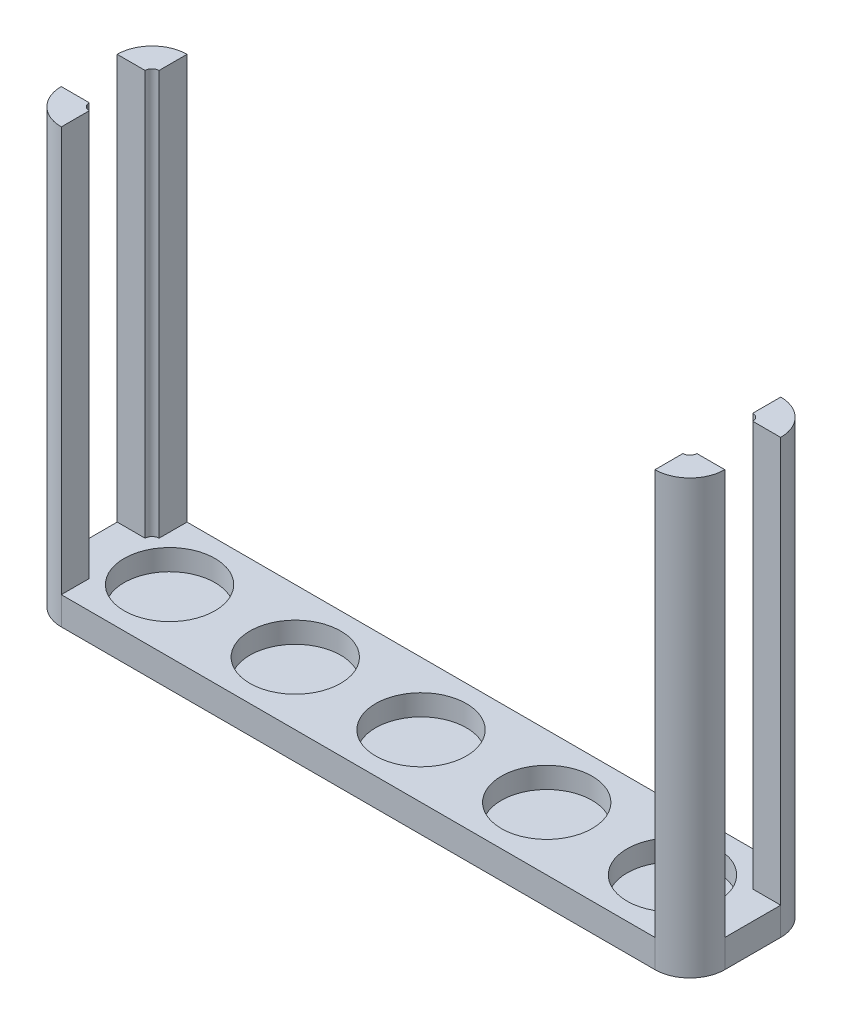
ISO-10303-21;
HEADER;
FILE_DESCRIPTION(('STEP AP214'),'2;1');
FILE_NAME('part.step','',(''),(''),'','','');
FILE_SCHEMA(('AUTOMOTIVE_DESIGN { 1 0 10303 214 1 1 1 1 }'));
ENDSEC;
DATA;
#1=APPLICATION_CONTEXT('core data for automotive mechanical design processes');
#2=APPLICATION_PROTOCOL_DEFINITION('international standard','automotive_design',2000,#1);
#3=PRODUCT_CONTEXT('',#1,'mechanical');
#4=PRODUCT('Part','Part','',(#3));
#5=PRODUCT_RELATED_PRODUCT_CATEGORY('part','',(#4));
#6=PRODUCT_DEFINITION_FORMATION('','',#4);
#7=PRODUCT_DEFINITION_CONTEXT('part definition',#1,'design');
#8=PRODUCT_DEFINITION('design','',#6,#7);
#9=PRODUCT_DEFINITION_SHAPE('','',#8);
#10=(LENGTH_UNIT() NAMED_UNIT(*) SI_UNIT(.MILLI.,.METRE.));
#11=(NAMED_UNIT(*) PLANE_ANGLE_UNIT() SI_UNIT($,.RADIAN.));
#12=(NAMED_UNIT(*) SI_UNIT($,.STERADIAN.) SOLID_ANGLE_UNIT());
#13=UNCERTAINTY_MEASURE_WITH_UNIT(LENGTH_MEASURE(1.E-05),#10,'distance_accuracy_value','');
#14=(GEOMETRIC_REPRESENTATION_CONTEXT(3) GLOBAL_UNCERTAINTY_ASSIGNED_CONTEXT((#13)) GLOBAL_UNIT_ASSIGNED_CONTEXT((#10,
#11,#12)) REPRESENTATION_CONTEXT('',''));
#15=CARTESIAN_POINT('',(0.,0.,0.));
#16=DIRECTION('',(0.,0.,1.));
#17=DIRECTION('',(1.,0.,0.));
#18=AXIS2_PLACEMENT_3D('',#15,#16,#17);
#19=CARTESIAN_POINT('',(0.,8.,0.));
#20=DIRECTION('',(0.,-1.,0.));
#21=DIRECTION('',(0.,0.,-1.));
#22=AXIS2_PLACEMENT_3D('',#19,#20,#21);
#23=PLANE('',#22);
#24=CARTESIAN_POINT('',(23.,8.,-18.));
#25=DIRECTION('',(0.,1.,0.));
#26=DIRECTION('',(0.,0.,1.));
#27=AXIS2_PLACEMENT_3D('',#24,#25,#26);
#28=CIRCLE('',#27,13.);
#29=CARTESIAN_POINT('',(23.,8.,-4.99999999999999));
#30=VERTEX_POINT('',#29);
#31=EDGE_CURVE('E319',#30,#30,#28,.T.);
#32=ORIENTED_EDGE('',*,*,#31,.F.);
#33=EDGE_LOOP('',(#32));
#34=FACE_BOUND('',#33,.T.);
#35=CARTESIAN_POINT('',(59.,8.,-18.));
#36=DIRECTION('',(0.,1.,0.));
#37=DIRECTION('',(0.,0.,1.));
#38=AXIS2_PLACEMENT_3D('',#35,#36,#37);
#39=CIRCLE('',#38,13.);
#40=CARTESIAN_POINT('',(59.,8.,-4.99999999999998));
#41=VERTEX_POINT('',#40);
#42=EDGE_CURVE('E322',#41,#41,#39,.T.);
#43=ORIENTED_EDGE('',*,*,#42,.F.);
#44=EDGE_LOOP('',(#43));
#45=FACE_BOUND('',#44,.T.);
#46=CARTESIAN_POINT('',(95.0046201605951,8.,-18.));
#47=DIRECTION('',(0.,1.,0.));
#48=DIRECTION('',(0.,0.,1.));
#49=AXIS2_PLACEMENT_3D('',#46,#47,#48);
#50=CIRCLE('',#49,13.);
#51=CARTESIAN_POINT('',(95.0046201605951,8.,-5.));
#52=VERTEX_POINT('',#51);
#53=EDGE_CURVE('E328',#52,#52,#50,.T.);
#54=ORIENTED_EDGE('',*,*,#53,.F.);
#55=EDGE_LOOP('',(#54));
#56=FACE_BOUND('',#55,.T.);
#57=CARTESIAN_POINT('',(131.004620160595,8.,-18.));
#58=DIRECTION('',(0.,1.,0.));
#59=DIRECTION('',(0.,0.,1.));
#60=AXIS2_PLACEMENT_3D('',#57,#58,#59);
#61=CIRCLE('',#60,13.);
#62=CARTESIAN_POINT('',(131.004620160595,8.,-5.00000000000002));
#63=VERTEX_POINT('',#62);
#64=EDGE_CURVE('E334',#63,#63,#61,.T.);
#65=ORIENTED_EDGE('',*,*,#64,.F.);
#66=EDGE_LOOP('',(#65));
#67=FACE_BOUND('',#66,.T.);
#68=CARTESIAN_POINT('',(167.002310080298,8.,-18.));
#69=DIRECTION('',(0.,1.,0.));
#70=DIRECTION('',(0.,0.,1.));
#71=AXIS2_PLACEMENT_3D('',#68,#69,#70);
#72=CIRCLE('',#71,12.9976899197025);
#73=CARTESIAN_POINT('',(167.002310080298,8.,-5.00231008029754));
#74=VERTEX_POINT('',#73);
#75=EDGE_CURVE('E340',#74,#74,#72,.T.);
#76=ORIENTED_EDGE('',*,*,#75,.F.);
#77=EDGE_LOOP('',(#76));
#78=FACE_BOUND('',#77,.T.);
#79=DIRECTION('',(0.,0.,1.));
#80=VECTOR('',#79,1.);
#81=CARTESIAN_POINT('',(180.,8.,0.));
#82=LINE('',#81,#80);
#83=CARTESIAN_POINT('',(180.,8.,-8.));
#84=VERTEX_POINT('',#83);
#85=CARTESIAN_POINT('',(180.,8.,0.));
#86=VERTEX_POINT('',#85);
#87=EDGE_CURVE('E276',#84,#86,#82,.T.);
#88=ORIENTED_EDGE('',*,*,#87,.F.);
#89=CARTESIAN_POINT('',(180.,8.,-10.));
#90=DIRECTION('',(0.,-1.,0.));
#91=DIRECTION('',(0.,0.,1.));
#92=AXIS2_PLACEMENT_3D('',#89,#90,#91);
#93=CIRCLE('',#92,2.);
#94=CARTESIAN_POINT('',(182.,8.,-10.));
#95=VERTEX_POINT('',#94);
#96=EDGE_CURVE('E279',#95,#84,#93,.T.);
#97=ORIENTED_EDGE('',*,*,#96,.F.);
#98=DIRECTION('',(-1.,0.,0.));
#99=VECTOR('',#98,1.);
#100=CARTESIAN_POINT('',(190.,8.,-10.));
#101=LINE('',#100,#99);
#102=CARTESIAN_POINT('',(190.,8.,-10.));
#103=VERTEX_POINT('',#102);
#104=EDGE_CURVE('E200',#103,#95,#101,.T.);
#105=ORIENTED_EDGE('',*,*,#104,.F.);
#106=DIRECTION('',(0.,0.,-1.));
#107=VECTOR('',#106,1.);
#108=CARTESIAN_POINT('',(190.,8.,0.));
#109=LINE('',#108,#107);
#110=CARTESIAN_POINT('',(190.,8.,-26.));
#111=VERTEX_POINT('',#110);
#112=EDGE_CURVE('E185',#103,#111,#109,.T.);
#113=ORIENTED_EDGE('',*,*,#112,.T.);
#114=DIRECTION('',(1.,0.,0.));
#115=VECTOR('',#114,1.);
#116=CARTESIAN_POINT('',(190.,8.,-26.));
#117=LINE('',#116,#115);
#118=CARTESIAN_POINT('',(182.,8.,-26.));
#119=VERTEX_POINT('',#118);
#120=EDGE_CURVE('E197',#119,#111,#117,.T.);
#121=ORIENTED_EDGE('',*,*,#120,.F.);
#122=CARTESIAN_POINT('',(180.,8.,-26.));
#123=DIRECTION('',(0.,-1.,0.));
#124=DIRECTION('',(0.,0.,-1.));
#125=AXIS2_PLACEMENT_3D('',#122,#123,#124);
#126=CIRCLE('',#125,2.);
#127=CARTESIAN_POINT('',(180.,8.,-28.));
#128=VERTEX_POINT('',#127);
#129=EDGE_CURVE('E211',#128,#119,#126,.T.);
#130=ORIENTED_EDGE('',*,*,#129,.F.);
#131=DIRECTION('',(0.,0.,1.));
#132=VECTOR('',#131,1.);
#133=CARTESIAN_POINT('',(180.,8.,-36.));
#134=LINE('',#133,#132);
#135=CARTESIAN_POINT('',(180.,8.,-36.));
#136=VERTEX_POINT('',#135);
#137=EDGE_CURVE('E212',#136,#128,#134,.T.);
#138=ORIENTED_EDGE('',*,*,#137,.F.);
#139=DIRECTION('',(-1.,0.,0.));
#140=VECTOR('',#139,1.);
#141=CARTESIAN_POINT('',(0.,8.,-36.));
#142=LINE('',#141,#140);
#143=CARTESIAN_POINT('',(10.,8.,-36.));
#144=VERTEX_POINT('',#143);
#145=EDGE_CURVE('E192',#136,#144,#142,.T.);
#146=ORIENTED_EDGE('',*,*,#145,.T.);
#147=DIRECTION('',(0.,0.,-1.));
#148=VECTOR('',#147,1.);
#149=CARTESIAN_POINT('',(9.99999999999999,8.,-36.));
#150=LINE('',#149,#148);
#151=CARTESIAN_POINT('',(10.,8.,-28.));
#152=VERTEX_POINT('',#151);
#153=EDGE_CURVE('E251',#152,#144,#150,.T.);
#154=ORIENTED_EDGE('',*,*,#153,.F.);
#155=CARTESIAN_POINT('',(10.,8.,-26.));
#156=DIRECTION('',(0.,-1.,0.));
#157=DIRECTION('',(0.,0.,-1.));
#158=AXIS2_PLACEMENT_3D('',#155,#156,#157);
#159=CIRCLE('',#158,2.);
#160=CARTESIAN_POINT('',(8.,8.,-26.));
#161=VERTEX_POINT('',#160);
#162=EDGE_CURVE('E254',#161,#152,#159,.T.);
#163=ORIENTED_EDGE('',*,*,#162,.F.);
#164=DIRECTION('',(1.,0.,0.));
#165=VECTOR('',#164,1.);
#166=CARTESIAN_POINT('',(0.,8.,-26.));
#167=LINE('',#166,#165);
#168=CARTESIAN_POINT('',(0.,8.,-26.));
#169=VERTEX_POINT('',#168);
#170=EDGE_CURVE('E222',#169,#161,#167,.T.);
#171=ORIENTED_EDGE('',*,*,#170,.F.);
#172=DIRECTION('',(0.,0.,1.));
#173=VECTOR('',#172,1.);
#174=CARTESIAN_POINT('',(0.,8.,0.));
#175=LINE('',#174,#173);
#176=CARTESIAN_POINT('',(0.,8.,-10.));
#177=VERTEX_POINT('',#176);
#178=EDGE_CURVE('E345',#169,#177,#175,.T.);
#179=ORIENTED_EDGE('',*,*,#178,.T.);
#180=DIRECTION('',(-1.,0.,0.));
#181=VECTOR('',#180,1.);
#182=CARTESIAN_POINT('',(0.,8.,-10.));
#183=LINE('',#182,#181);
#184=CARTESIAN_POINT('',(8.,8.,-10.));
#185=VERTEX_POINT('',#184);
#186=EDGE_CURVE('E291',#185,#177,#183,.T.);
#187=ORIENTED_EDGE('',*,*,#186,.F.);
#188=CARTESIAN_POINT('',(10.,8.,-10.));
#189=DIRECTION('',(0.,-1.,0.));
#190=DIRECTION('',(0.,0.,1.));
#191=AXIS2_PLACEMENT_3D('',#188,#189,#190);
#192=CIRCLE('',#191,2.);
#193=CARTESIAN_POINT('',(10.,8.,-8.));
#194=VERTEX_POINT('',#193);
#195=EDGE_CURVE('E298',#194,#185,#192,.T.);
#196=ORIENTED_EDGE('',*,*,#195,.F.);
#197=DIRECTION('',(0.,0.,-1.));
#198=VECTOR('',#197,1.);
#199=CARTESIAN_POINT('',(10.,8.,0.));
#200=LINE('',#199,#198);
#201=CARTESIAN_POINT('',(10.,8.,0.));
#202=VERTEX_POINT('',#201);
#203=EDGE_CURVE('E232',#202,#194,#200,.T.);
#204=ORIENTED_EDGE('',*,*,#203,.F.);
#205=DIRECTION('',(1.,0.,0.));
#206=VECTOR('',#205,1.);
#207=CARTESIAN_POINT('',(0.,8.,0.));
#208=LINE('',#207,#206);
#209=EDGE_CURVE('E201',#202,#86,#208,.T.);
#210=ORIENTED_EDGE('',*,*,#209,.T.);
#211=EDGE_LOOP('',(#88,#97,#105,#113,#121,#130,#138,#146,#154,#163,#171,#179,#187,#196,#204,#210));
#212=FACE_BOUND('',#211,.T.);
#213=ADVANCED_FACE('F44',(#34,#45,#56,#67,#78,#212),#23,.F.);
#214=CARTESIAN_POINT('',(0.,8.,0.));
#215=DIRECTION('',(1.,0.,0.));
#216=DIRECTION('',(0.,0.,-1.));
#217=AXIS2_PLACEMENT_3D('',#214,#215,#216);
#218=PLANE('',#217);
#219=ORIENTED_EDGE('',*,*,#178,.F.);
#220=DIRECTION('',(0.,-1.,0.));
#221=VECTOR('',#220,1.);
#222=CARTESIAN_POINT('',(0.,8.,-26.));
#223=LINE('',#222,#221);
#224=CARTESIAN_POINT('',(0.,0.,-26.));
#225=VERTEX_POINT('',#224);
#226=EDGE_CURVE('E380',#169,#225,#223,.T.);
#227=ORIENTED_EDGE('',*,*,#226,.T.);
#228=DIRECTION('',(0.,0.,1.));
#229=VECTOR('',#228,1.);
#230=CARTESIAN_POINT('',(0.,0.,0.));
#231=LINE('',#230,#229);
#232=CARTESIAN_POINT('',(0.,0.,-10.));
#233=VERTEX_POINT('',#232);
#234=EDGE_CURVE('E318',#225,#233,#231,.T.);
#235=ORIENTED_EDGE('',*,*,#234,.T.);
#236=DIRECTION('',(0.,-1.,0.));
#237=VECTOR('',#236,1.);
#238=CARTESIAN_POINT('',(0.,8.,-10.));
#239=LINE('',#238,#237);
#240=EDGE_CURVE('E378',#233,#177,#239,.F.);
#241=ORIENTED_EDGE('',*,*,#240,.T.);
#242=EDGE_LOOP('',(#219,#227,#235,#241));
#243=FACE_BOUND('',#242,.T.);
#244=ADVANCED_FACE('F400',(#243),#218,.F.);
#245=CARTESIAN_POINT('',(0.,8.,0.));
#246=DIRECTION('',(0.,0.,-1.));
#247=DIRECTION('',(-1.,0.,0.));
#248=AXIS2_PLACEMENT_3D('',#245,#246,#247);
#249=PLANE('',#248);
#250=DIRECTION('',(1.,0.,0.));
#251=VECTOR('',#250,1.);
#252=CARTESIAN_POINT('',(0.,0.,0.));
#253=LINE('',#252,#251);
#254=CARTESIAN_POINT('',(10.,0.,0.));
#255=VERTEX_POINT('',#254);
#256=CARTESIAN_POINT('',(180.,0.,0.));
#257=VERTEX_POINT('',#256);
#258=EDGE_CURVE('E355',#255,#257,#253,.T.);
#259=ORIENTED_EDGE('',*,*,#258,.T.);
#260=DIRECTION('',(0.,-1.,0.));
#261=VECTOR('',#260,1.);
#262=CARTESIAN_POINT('',(180.,8.,0.));
#263=LINE('',#262,#261);
#264=EDGE_CURVE('E369',#257,#86,#263,.F.);
#265=ORIENTED_EDGE('',*,*,#264,.T.);
#266=ORIENTED_EDGE('',*,*,#209,.F.);
#267=DIRECTION('',(0.,-1.,0.));
#268=VECTOR('',#267,1.);
#269=CARTESIAN_POINT('',(10.,8.,0.));
#270=LINE('',#269,#268);
#271=EDGE_CURVE('E66',#202,#255,#270,.T.);
#272=ORIENTED_EDGE('',*,*,#271,.T.);
#273=EDGE_LOOP('',(#259,#265,#266,#272));
#274=FACE_BOUND('',#273,.T.);
#275=ADVANCED_FACE('F419',(#274),#249,.F.);
#276=CARTESIAN_POINT('',(190.,8.,0.));
#277=DIRECTION('',(-1.,0.,0.));
#278=DIRECTION('',(0.,0.,1.));
#279=AXIS2_PLACEMENT_3D('',#276,#277,#278);
#280=PLANE('',#279);
#281=ORIENTED_EDGE('',*,*,#112,.F.);
#282=DIRECTION('',(0.,-1.,0.));
#283=VECTOR('',#282,1.);
#284=CARTESIAN_POINT('',(190.,8.,-10.));
#285=LINE('',#284,#283);
#286=CARTESIAN_POINT('',(190.,0.,-10.));
#287=VERTEX_POINT('',#286);
#288=EDGE_CURVE('E191',#103,#287,#285,.T.);
#289=ORIENTED_EDGE('',*,*,#288,.T.);
#290=DIRECTION('',(0.,0.,-1.));
#291=VECTOR('',#290,1.);
#292=CARTESIAN_POINT('',(190.,0.,0.));
#293=LINE('',#292,#291);
#294=CARTESIAN_POINT('',(190.,0.,-26.));
#295=VERTEX_POINT('',#294);
#296=EDGE_CURVE('E187',#287,#295,#293,.T.);
#297=ORIENTED_EDGE('',*,*,#296,.T.);
#298=DIRECTION('',(0.,-1.,0.));
#299=VECTOR('',#298,1.);
#300=CARTESIAN_POINT('',(190.,8.,-26.));
#301=LINE('',#300,#299);
#302=EDGE_CURVE('E182',#295,#111,#301,.F.);
#303=ORIENTED_EDGE('',*,*,#302,.T.);
#304=EDGE_LOOP('',(#281,#289,#297,#303));
#305=FACE_BOUND('',#304,.T.);
#306=ADVANCED_FACE('F184',(#305),#280,.F.);
#307=CARTESIAN_POINT('',(0.,8.,-36.));
#308=DIRECTION('',(0.,0.,1.));
#309=DIRECTION('',(1.,0.,0.));
#310=AXIS2_PLACEMENT_3D('',#307,#308,#309);
#311=PLANE('',#310);
#312=ORIENTED_EDGE('',*,*,#145,.F.);
#313=DIRECTION('',(0.,-1.,0.));
#314=VECTOR('',#313,1.);
#315=CARTESIAN_POINT('',(180.,8.,-36.));
#316=LINE('',#315,#314);
#317=CARTESIAN_POINT('',(180.,0.,-36.));
#318=VERTEX_POINT('',#317);
#319=EDGE_CURVE('E375',#136,#318,#316,.T.);
#320=ORIENTED_EDGE('',*,*,#319,.T.);
#321=DIRECTION('',(-1.,0.,0.));
#322=VECTOR('',#321,1.);
#323=CARTESIAN_POINT('',(0.,0.,-36.));
#324=LINE('',#323,#322);
#325=CARTESIAN_POINT('',(10.,0.,-36.));
#326=VERTEX_POINT('',#325);
#327=EDGE_CURVE('E348',#318,#326,#324,.T.);
#328=ORIENTED_EDGE('',*,*,#327,.T.);
#329=DIRECTION('',(0.,-1.,0.));
#330=VECTOR('',#329,1.);
#331=CARTESIAN_POINT('',(10.,8.,-36.));
#332=LINE('',#331,#330);
#333=EDGE_CURVE('E373',#326,#144,#332,.F.);
#334=ORIENTED_EDGE('',*,*,#333,.T.);
#335=EDGE_LOOP('',(#312,#320,#328,#334));
#336=FACE_BOUND('',#335,.T.);
#337=ADVANCED_FACE('F444',(#336),#311,.F.);
#338=CARTESIAN_POINT('',(0.,0.,0.));
#339=DIRECTION('',(0.,-1.,0.));
#340=DIRECTION('',(0.,0.,-1.));
#341=AXIS2_PLACEMENT_3D('',#338,#339,#340);
#342=PLANE('',#341);
#343=ORIENTED_EDGE('',*,*,#296,.F.);
#344=CARTESIAN_POINT('',(180.,0.,-10.));
#345=DIRECTION('',(0.,-1.,0.));
#346=DIRECTION('',(0.,0.,-1.));
#347=AXIS2_PLACEMENT_3D('',#344,#345,#346);
#348=CIRCLE('',#347,10.);
#349=EDGE_CURVE('E59',#287,#257,#348,.T.);
#350=ORIENTED_EDGE('',*,*,#349,.T.);
#351=ORIENTED_EDGE('',*,*,#258,.F.);
#352=CARTESIAN_POINT('',(10.,0.,-10.));
#353=DIRECTION('',(0.,-1.,0.));
#354=DIRECTION('',(0.,0.,-1.));
#355=AXIS2_PLACEMENT_3D('',#352,#353,#354);
#356=CIRCLE('',#355,10.);
#357=EDGE_CURVE('E361',#255,#233,#356,.T.);
#358=ORIENTED_EDGE('',*,*,#357,.T.);
#359=ORIENTED_EDGE('',*,*,#234,.F.);
#360=CARTESIAN_POINT('',(10.,0.,-26.));
#361=DIRECTION('',(0.,-1.,0.));
#362=DIRECTION('',(0.,0.,-1.));
#363=AXIS2_PLACEMENT_3D('',#360,#361,#362);
#364=CIRCLE('',#363,10.);
#365=EDGE_CURVE('E363',#225,#326,#364,.T.);
#366=ORIENTED_EDGE('',*,*,#365,.T.);
#367=ORIENTED_EDGE('',*,*,#327,.F.);
#368=CARTESIAN_POINT('',(180.,0.,-26.));
#369=DIRECTION('',(0.,-1.,0.));
#370=DIRECTION('',(0.,0.,-1.));
#371=AXIS2_PLACEMENT_3D('',#368,#369,#370);
#372=CIRCLE('',#371,10.);
#373=EDGE_CURVE('E365',#318,#295,#372,.T.);
#374=ORIENTED_EDGE('',*,*,#373,.T.);
#375=EDGE_LOOP('',(#343,#350,#351,#358,#359,#366,#367,#374));
#376=FACE_BOUND('',#375,.T.);
#377=ADVANCED_FACE('F437',(#376),#342,.T.);
#378=CARTESIAN_POINT('',(167.002310080298,2.,-18.));
#379=DIRECTION('',(0.,1.,0.));
#380=DIRECTION('',(0.,0.,1.));
#381=AXIS2_PLACEMENT_3D('',#378,#379,#380);
#382=CYLINDRICAL_SURFACE('',#381,12.9976899197025);
#383=CARTESIAN_POINT('',(167.002310080298,2.,-18.));
#384=DIRECTION('',(0.,1.,0.));
#385=DIRECTION('',(0.,0.,1.));
#386=AXIS2_PLACEMENT_3D('',#383,#384,#385);
#387=CIRCLE('',#386,12.9976899197025);
#388=CARTESIAN_POINT('',(167.002310080298,2.,-5.00231008029754));
#389=VERTEX_POINT('',#388);
#390=EDGE_CURVE('E314',#389,#389,#387,.T.);
#391=ORIENTED_EDGE('',*,*,#390,.F.);
#392=EDGE_LOOP('',(#391));
#393=FACE_BOUND('',#392,.T.);
#394=ORIENTED_EDGE('',*,*,#75,.T.);
#395=EDGE_LOOP('',(#394));
#396=FACE_BOUND('',#395,.T.);
#397=ADVANCED_FACE('F480',(#393,#396),#382,.F.);
#398=CARTESIAN_POINT('',(167.002310080298,2.,-18.));
#399=DIRECTION('',(0.,1.,0.));
#400=DIRECTION('',(0.,0.,1.));
#401=AXIS2_PLACEMENT_3D('',#398,#399,#400);
#402=PLANE('',#401);
#403=ORIENTED_EDGE('',*,*,#390,.T.);
#404=EDGE_LOOP('',(#403));
#405=FACE_BOUND('',#404,.T.);
#406=ADVANCED_FACE('F476',(#405),#402,.T.);
#407=CARTESIAN_POINT('',(131.004620160595,2.,-18.));
#408=DIRECTION('',(0.,1.,0.));
#409=DIRECTION('',(0.,0.,1.));
#410=AXIS2_PLACEMENT_3D('',#407,#408,#409);
#411=CYLINDRICAL_SURFACE('',#410,13.);
#412=CARTESIAN_POINT('',(131.004620160595,2.,-18.));
#413=DIRECTION('',(0.,1.,0.));
#414=DIRECTION('',(0.,0.,1.));
#415=AXIS2_PLACEMENT_3D('',#412,#413,#414);
#416=CIRCLE('',#415,13.);
#417=CARTESIAN_POINT('',(131.004620160595,2.,-5.00000000000002));
#418=VERTEX_POINT('',#417);
#419=EDGE_CURVE('E337',#418,#418,#416,.T.);
#420=ORIENTED_EDGE('',*,*,#419,.F.);
#421=EDGE_LOOP('',(#420));
#422=FACE_BOUND('',#421,.T.);
#423=ORIENTED_EDGE('',*,*,#64,.T.);
#424=EDGE_LOOP('',(#423));
#425=FACE_BOUND('',#424,.T.);
#426=ADVANCED_FACE('F676',(#422,#425),#411,.F.);
#427=CARTESIAN_POINT('',(131.004620160595,2.,-18.));
#428=DIRECTION('',(0.,1.,0.));
#429=DIRECTION('',(0.,0.,1.));
#430=AXIS2_PLACEMENT_3D('',#427,#428,#429);
#431=PLANE('',#430);
#432=ORIENTED_EDGE('',*,*,#419,.T.);
#433=EDGE_LOOP('',(#432));
#434=FACE_BOUND('',#433,.T.);
#435=ADVANCED_FACE('F685',(#434),#431,.T.);
#436=CARTESIAN_POINT('',(95.0046201605951,2.,-18.));
#437=DIRECTION('',(0.,1.,0.));
#438=DIRECTION('',(0.,0.,1.));
#439=AXIS2_PLACEMENT_3D('',#436,#437,#438);
#440=CYLINDRICAL_SURFACE('',#439,13.);
#441=CARTESIAN_POINT('',(95.0046201605951,2.,-18.));
#442=DIRECTION('',(0.,1.,0.));
#443=DIRECTION('',(0.,0.,1.));
#444=AXIS2_PLACEMENT_3D('',#441,#442,#443);
#445=CIRCLE('',#444,13.);
#446=CARTESIAN_POINT('',(95.0046201605951,2.,-5.));
#447=VERTEX_POINT('',#446);
#448=EDGE_CURVE('E331',#447,#447,#445,.T.);
#449=ORIENTED_EDGE('',*,*,#448,.F.);
#450=EDGE_LOOP('',(#449));
#451=FACE_BOUND('',#450,.T.);
#452=ORIENTED_EDGE('',*,*,#53,.T.);
#453=EDGE_LOOP('',(#452));
#454=FACE_BOUND('',#453,.T.);
#455=ADVANCED_FACE('F695',(#451,#454),#440,.F.);
#456=CARTESIAN_POINT('',(95.0046201605951,2.,-18.));
#457=DIRECTION('',(0.,1.,0.));
#458=DIRECTION('',(0.,0.,1.));
#459=AXIS2_PLACEMENT_3D('',#456,#457,#458);
#460=PLANE('',#459);
#461=ORIENTED_EDGE('',*,*,#448,.T.);
#462=EDGE_LOOP('',(#461));
#463=FACE_BOUND('',#462,.T.);
#464=ADVANCED_FACE('F705',(#463),#460,.T.);
#465=CARTESIAN_POINT('',(59.,2.,-18.));
#466=DIRECTION('',(0.,1.,0.));
#467=DIRECTION('',(0.,0.,1.));
#468=AXIS2_PLACEMENT_3D('',#465,#466,#467);
#469=CYLINDRICAL_SURFACE('',#468,13.);
#470=CARTESIAN_POINT('',(59.,2.,-18.));
#471=DIRECTION('',(0.,1.,0.));
#472=DIRECTION('',(0.,0.,1.));
#473=AXIS2_PLACEMENT_3D('',#470,#471,#472);
#474=CIRCLE('',#473,13.);
#475=CARTESIAN_POINT('',(59.,2.,-4.99999999999998));
#476=VERTEX_POINT('',#475);
#477=EDGE_CURVE('E325',#476,#476,#474,.T.);
#478=ORIENTED_EDGE('',*,*,#477,.F.);
#479=EDGE_LOOP('',(#478));
#480=FACE_BOUND('',#479,.T.);
#481=ORIENTED_EDGE('',*,*,#42,.T.);
#482=EDGE_LOOP('',(#481));
#483=FACE_BOUND('',#482,.T.);
#484=ADVANCED_FACE('F715',(#480,#483),#469,.F.);
#485=CARTESIAN_POINT('',(59.,2.,-18.));
#486=DIRECTION('',(0.,1.,0.));
#487=DIRECTION('',(0.,0.,1.));
#488=AXIS2_PLACEMENT_3D('',#485,#486,#487);
#489=PLANE('',#488);
#490=ORIENTED_EDGE('',*,*,#477,.T.);
#491=EDGE_LOOP('',(#490));
#492=FACE_BOUND('',#491,.T.);
#493=ADVANCED_FACE('F725',(#492),#489,.T.);
#494=CARTESIAN_POINT('',(23.,2.,-18.));
#495=DIRECTION('',(0.,1.,0.));
#496=DIRECTION('',(0.,0.,1.));
#497=AXIS2_PLACEMENT_3D('',#494,#495,#496);
#498=CYLINDRICAL_SURFACE('',#497,13.);
#499=CARTESIAN_POINT('',(23.,2.,-18.));
#500=DIRECTION('',(0.,1.,0.));
#501=DIRECTION('',(0.,0.,1.));
#502=AXIS2_PLACEMENT_3D('',#499,#500,#501);
#503=CIRCLE('',#502,13.);
#504=CARTESIAN_POINT('',(23.,2.,-4.99999999999999));
#505=VERTEX_POINT('',#504);
#506=EDGE_CURVE('E315',#505,#505,#503,.T.);
#507=ORIENTED_EDGE('',*,*,#506,.F.);
#508=EDGE_LOOP('',(#507));
#509=FACE_BOUND('',#508,.T.);
#510=ORIENTED_EDGE('',*,*,#31,.T.);
#511=EDGE_LOOP('',(#510));
#512=FACE_BOUND('',#511,.T.);
#513=ADVANCED_FACE('F735',(#509,#512),#498,.F.);
#514=CARTESIAN_POINT('',(23.,2.,-18.));
#515=DIRECTION('',(0.,1.,0.));
#516=DIRECTION('',(0.,0.,1.));
#517=AXIS2_PLACEMENT_3D('',#514,#515,#516);
#518=PLANE('',#517);
#519=ORIENTED_EDGE('',*,*,#506,.T.);
#520=EDGE_LOOP('',(#519));
#521=FACE_BOUND('',#520,.T.);
#522=ADVANCED_FACE('F638',(#521),#518,.T.);
#523=CARTESIAN_POINT('',(10.,124.,0.));
#524=DIRECTION('',(-1.,0.,0.));
#525=DIRECTION('',(0.,0.,1.));
#526=AXIS2_PLACEMENT_3D('',#523,#524,#525);
#527=PLANE('',#526);
#528=ORIENTED_EDGE('',*,*,#203,.T.);
#529=DIRECTION('',(0.,-1.,0.));
#530=VECTOR('',#529,1.);
#531=CARTESIAN_POINT('',(10.,124.,-8.));
#532=LINE('',#531,#530);
#533=CARTESIAN_POINT('',(10.,124.,-8.));
#534=VERTEX_POINT('',#533);
#535=EDGE_CURVE('E308',#534,#194,#532,.T.);
#536=ORIENTED_EDGE('',*,*,#535,.F.);
#537=DIRECTION('',(0.,0.,-1.));
#538=VECTOR('',#537,1.);
#539=CARTESIAN_POINT('',(10.,124.,0.));
#540=LINE('',#539,#538);
#541=CARTESIAN_POINT('',(10.,124.,0.));
#542=VERTEX_POINT('',#541);
#543=EDGE_CURVE('E288',#542,#534,#540,.T.);
#544=ORIENTED_EDGE('',*,*,#543,.F.);
#545=DIRECTION('',(0.,-1.,0.));
#546=VECTOR('',#545,1.);
#547=CARTESIAN_POINT('',(10.,124.,0.));
#548=LINE('',#547,#546);
#549=EDGE_CURVE('E311',#542,#202,#548,.T.);
#550=ORIENTED_EDGE('',*,*,#549,.T.);
#551=EDGE_LOOP('',(#528,#536,#544,#550));
#552=FACE_BOUND('',#551,.T.);
#553=ADVANCED_FACE('F418',(#552),#527,.F.);
#554=CARTESIAN_POINT('',(10.,124.,-10.));
#555=DIRECTION('',(0.,-1.,0.));
#556=DIRECTION('',(0.,0.,-1.));
#557=AXIS2_PLACEMENT_3D('',#554,#555,#556);
#558=CYLINDRICAL_SURFACE('',#557,2.);
#559=ORIENTED_EDGE('',*,*,#195,.T.);
#560=DIRECTION('',(0.,-1.,0.));
#561=VECTOR('',#560,1.);
#562=CARTESIAN_POINT('',(8.,124.,-10.));
#563=LINE('',#562,#561);
#564=CARTESIAN_POINT('',(8.,124.,-10.));
#565=VERTEX_POINT('',#564);
#566=EDGE_CURVE('E305',#565,#185,#563,.T.);
#567=ORIENTED_EDGE('',*,*,#566,.F.);
#568=CARTESIAN_POINT('',(10.,124.,-10.));
#569=DIRECTION('',(0.,-1.,0.));
#570=DIRECTION('',(0.,0.,1.));
#571=AXIS2_PLACEMENT_3D('',#568,#569,#570);
#572=CIRCLE('',#571,2.);
#573=EDGE_CURVE('E290',#534,#565,#572,.T.);
#574=ORIENTED_EDGE('',*,*,#573,.F.);
#575=ORIENTED_EDGE('',*,*,#535,.T.);
#576=EDGE_LOOP('',(#559,#567,#574,#575));
#577=FACE_BOUND('',#576,.T.);
#578=ADVANCED_FACE('F413',(#577),#558,.F.);
#579=CARTESIAN_POINT('',(0.,124.,-10.));
#580=DIRECTION('',(0.,0.,1.));
#581=DIRECTION('',(1.,0.,0.));
#582=AXIS2_PLACEMENT_3D('',#579,#580,#581);
#583=PLANE('',#582);
#584=ORIENTED_EDGE('',*,*,#186,.T.);
#585=DIRECTION('',(0.,-1.,0.));
#586=VECTOR('',#585,1.);
#587=CARTESIAN_POINT('',(0.,124.,-10.));
#588=LINE('',#587,#586);
#589=CARTESIAN_POINT('',(0.,124.,-10.));
#590=VERTEX_POINT('',#589);
#591=EDGE_CURVE('E295',#590,#177,#588,.T.);
#592=ORIENTED_EDGE('',*,*,#591,.F.);
#593=DIRECTION('',(-1.,0.,0.));
#594=VECTOR('',#593,1.);
#595=CARTESIAN_POINT('',(0.,124.,-10.));
#596=LINE('',#595,#594);
#597=EDGE_CURVE('E293',#565,#590,#596,.T.);
#598=ORIENTED_EDGE('',*,*,#597,.F.);
#599=ORIENTED_EDGE('',*,*,#566,.T.);
#600=EDGE_LOOP('',(#584,#592,#598,#599));
#601=FACE_BOUND('',#600,.T.);
#602=ADVANCED_FACE('F409',(#601),#583,.F.);
#603=CARTESIAN_POINT('',(10.,124.,-10.));
#604=DIRECTION('',(0.,1.,0.));
#605=DIRECTION('',(0.,0.,1.));
#606=AXIS2_PLACEMENT_3D('',#603,#604,#605);
#607=PLANE('',#606);
#608=ORIENTED_EDGE('',*,*,#597,.T.);
#609=CARTESIAN_POINT('',(10.,124.,-10.));
#610=DIRECTION('',(0.,1.,0.));
#611=DIRECTION('',(0.,0.,1.));
#612=AXIS2_PLACEMENT_3D('',#609,#610,#611);
#613=CIRCLE('',#612,10.);
#614=EDGE_CURVE('E11',#590,#542,#613,.T.);
#615=ORIENTED_EDGE('',*,*,#614,.T.);
#616=ORIENTED_EDGE('',*,*,#543,.T.);
#617=ORIENTED_EDGE('',*,*,#573,.T.);
#618=EDGE_LOOP('',(#608,#615,#616,#617));
#619=FACE_BOUND('',#618,.T.);
#620=ADVANCED_FACE('F453',(#619),#607,.T.);
#621=CARTESIAN_POINT('',(180.,124.,-26.));
#622=DIRECTION('',(0.,-1.,0.));
#623=DIRECTION('',(0.,0.,-1.));
#624=AXIS2_PLACEMENT_3D('',#621,#622,#623);
#625=CYLINDRICAL_SURFACE('',#624,2.);
#626=ORIENTED_EDGE('',*,*,#129,.T.);
#627=DIRECTION('',(0.,-1.,0.));
#628=VECTOR('',#627,1.);
#629=CARTESIAN_POINT('',(182.,124.,-26.));
#630=LINE('',#629,#628);
#631=CARTESIAN_POINT('',(182.,124.,-26.));
#632=VERTEX_POINT('',#631);
#633=EDGE_CURVE('E209',#632,#119,#630,.T.);
#634=ORIENTED_EDGE('',*,*,#633,.F.);
#635=CARTESIAN_POINT('',(180.,124.,-26.));
#636=DIRECTION('',(0.,-1.,0.));
#637=DIRECTION('',(0.,0.,-1.));
#638=AXIS2_PLACEMENT_3D('',#635,#636,#637);
#639=CIRCLE('',#638,2.);
#640=CARTESIAN_POINT('',(180.,124.,-28.));
#641=VERTEX_POINT('',#640);
#642=EDGE_CURVE('E229',#641,#632,#639,.T.);
#643=ORIENTED_EDGE('',*,*,#642,.F.);
#644=DIRECTION('',(0.,-1.,0.));
#645=VECTOR('',#644,1.);
#646=CARTESIAN_POINT('',(180.,124.,-28.));
#647=LINE('',#646,#645);
#648=EDGE_CURVE('E220',#641,#128,#647,.T.);
#649=ORIENTED_EDGE('',*,*,#648,.T.);
#650=EDGE_LOOP('',(#626,#634,#643,#649));
#651=FACE_BOUND('',#650,.T.);
#652=ADVANCED_FACE('F451',(#651),#625,.F.);
#653=CARTESIAN_POINT('',(190.,124.,-26.));
#654=DIRECTION('',(0.,0.,-1.));
#655=DIRECTION('',(-1.,0.,0.));
#656=AXIS2_PLACEMENT_3D('',#653,#654,#655);
#657=PLANE('',#656);
#658=ORIENTED_EDGE('',*,*,#120,.T.);
#659=DIRECTION('',(0.,-1.,0.));
#660=VECTOR('',#659,1.);
#661=CARTESIAN_POINT('',(190.,124.,-26.));
#662=LINE('',#661,#660);
#663=CARTESIAN_POINT('',(190.,124.,-26.));
#664=VERTEX_POINT('',#663);
#665=EDGE_CURVE('E206',#664,#111,#662,.T.);
#666=ORIENTED_EDGE('',*,*,#665,.F.);
#667=DIRECTION('',(1.,0.,0.));
#668=VECTOR('',#667,1.);
#669=CARTESIAN_POINT('',(190.,124.,-26.));
#670=LINE('',#669,#668);
#671=EDGE_CURVE('E234',#632,#664,#670,.T.);
#672=ORIENTED_EDGE('',*,*,#671,.F.);
#673=ORIENTED_EDGE('',*,*,#633,.T.);
#674=EDGE_LOOP('',(#658,#666,#672,#673));
#675=FACE_BOUND('',#674,.T.);
#676=ADVANCED_FACE('F205',(#675),#657,.F.);
#677=CARTESIAN_POINT('',(180.,124.,-36.));
#678=DIRECTION('',(1.,0.,0.));
#679=DIRECTION('',(0.,0.,-1.));
#680=AXIS2_PLACEMENT_3D('',#677,#678,#679);
#681=PLANE('',#680);
#682=ORIENTED_EDGE('',*,*,#137,.T.);
#683=ORIENTED_EDGE('',*,*,#648,.F.);
#684=DIRECTION('',(0.,0.,1.));
#685=VECTOR('',#684,1.);
#686=CARTESIAN_POINT('',(180.,124.,-36.));
#687=LINE('',#686,#685);
#688=CARTESIAN_POINT('',(180.,124.,-36.));
#689=VERTEX_POINT('',#688);
#690=EDGE_CURVE('E227',#689,#641,#687,.T.);
#691=ORIENTED_EDGE('',*,*,#690,.F.);
#692=DIRECTION('',(0.,-1.,0.));
#693=VECTOR('',#692,1.);
#694=CARTESIAN_POINT('',(180.,124.,-36.));
#695=LINE('',#694,#693);
#696=EDGE_CURVE('E217',#689,#136,#695,.T.);
#697=ORIENTED_EDGE('',*,*,#696,.T.);
#698=EDGE_LOOP('',(#682,#683,#691,#697));
#699=FACE_BOUND('',#698,.T.);
#700=ADVANCED_FACE('F446',(#699),#681,.F.);
#701=CARTESIAN_POINT('',(180.,124.,-26.));
#702=DIRECTION('',(0.,-1.,0.));
#703=DIRECTION('',(0.,0.,-1.));
#704=AXIS2_PLACEMENT_3D('',#701,#702,#703);
#705=PLANE('',#704);
#706=ORIENTED_EDGE('',*,*,#671,.T.);
#707=CARTESIAN_POINT('',(180.,124.,-26.));
#708=DIRECTION('',(0.,-1.,0.));
#709=DIRECTION('',(0.,0.,-1.));
#710=AXIS2_PLACEMENT_3D('',#707,#708,#709);
#711=CIRCLE('',#710,10.);
#712=EDGE_CURVE('E216',#664,#689,#711,.F.);
#713=ORIENTED_EDGE('',*,*,#712,.T.);
#714=ORIENTED_EDGE('',*,*,#690,.T.);
#715=ORIENTED_EDGE('',*,*,#642,.T.);
#716=EDGE_LOOP('',(#706,#713,#714,#715));
#717=FACE_BOUND('',#716,.T.);
#718=ADVANCED_FACE('F449',(#717),#705,.F.);
#719=CARTESIAN_POINT('',(0.,124.,-26.));
#720=DIRECTION('',(0.,0.,-1.));
#721=DIRECTION('',(-1.,0.,0.));
#722=AXIS2_PLACEMENT_3D('',#719,#720,#721);
#723=PLANE('',#722);
#724=ORIENTED_EDGE('',*,*,#170,.T.);
#725=DIRECTION('',(0.,-1.,0.));
#726=VECTOR('',#725,1.);
#727=CARTESIAN_POINT('',(8.,124.,-26.));
#728=LINE('',#727,#726);
#729=CARTESIAN_POINT('',(8.,124.,-26.));
#730=VERTEX_POINT('',#729);
#731=EDGE_CURVE('E241',#730,#161,#728,.T.);
#732=ORIENTED_EDGE('',*,*,#731,.F.);
#733=DIRECTION('',(1.,0.,0.));
#734=VECTOR('',#733,1.);
#735=CARTESIAN_POINT('',(0.,124.,-26.));
#736=LINE('',#735,#734);
#737=CARTESIAN_POINT('',(0.,124.,-26.));
#738=VERTEX_POINT('',#737);
#739=EDGE_CURVE('E255',#738,#730,#736,.T.);
#740=ORIENTED_EDGE('',*,*,#739,.F.);
#741=DIRECTION('',(0.,-1.,0.));
#742=VECTOR('',#741,1.);
#743=CARTESIAN_POINT('',(0.,124.,-26.));
#744=LINE('',#743,#742);
#745=EDGE_CURVE('E238',#738,#169,#744,.T.);
#746=ORIENTED_EDGE('',*,*,#745,.T.);
#747=EDGE_LOOP('',(#724,#732,#740,#746));
#748=FACE_BOUND('',#747,.T.);
#749=ADVANCED_FACE('F391',(#748),#723,.F.);
#750=CARTESIAN_POINT('',(10.,124.,-26.));
#751=DIRECTION('',(0.,-1.,0.));
#752=DIRECTION('',(0.,0.,-1.));
#753=AXIS2_PLACEMENT_3D('',#750,#751,#752);
#754=CYLINDRICAL_SURFACE('',#753,2.);
#755=ORIENTED_EDGE('',*,*,#162,.T.);
#756=DIRECTION('',(0.,-1.,0.));
#757=VECTOR('',#756,1.);
#758=CARTESIAN_POINT('',(10.,124.,-28.));
#759=LINE('',#758,#757);
#760=CARTESIAN_POINT('',(10.,124.,-28.));
#761=VERTEX_POINT('',#760);
#762=EDGE_CURVE('E244',#761,#152,#759,.T.);
#763=ORIENTED_EDGE('',*,*,#762,.F.);
#764=CARTESIAN_POINT('',(10.,124.,-26.));
#765=DIRECTION('',(0.,-1.,0.));
#766=DIRECTION('',(0.,0.,-1.));
#767=AXIS2_PLACEMENT_3D('',#764,#765,#766);
#768=CIRCLE('',#767,2.);
#769=EDGE_CURVE('E261',#730,#761,#768,.T.);
#770=ORIENTED_EDGE('',*,*,#769,.F.);
#771=ORIENTED_EDGE('',*,*,#731,.T.);
#772=EDGE_LOOP('',(#755,#763,#770,#771));
#773=FACE_BOUND('',#772,.T.);
#774=ADVANCED_FACE('F564',(#773),#754,.F.);
#775=CARTESIAN_POINT('',(9.99999999999999,124.,-36.));
#776=DIRECTION('',(-1.,0.,0.));
#777=DIRECTION('',(0.,0.,1.));
#778=AXIS2_PLACEMENT_3D('',#775,#776,#777);
#779=PLANE('',#778);
#780=ORIENTED_EDGE('',*,*,#153,.T.);
#781=DIRECTION('',(0.,-1.,0.));
#782=VECTOR('',#781,1.);
#783=CARTESIAN_POINT('',(9.99999999999999,124.,-36.));
#784=LINE('',#783,#782);
#785=CARTESIAN_POINT('',(9.99999999999999,124.,-36.));
#786=VERTEX_POINT('',#785);
#787=EDGE_CURVE('E247',#786,#144,#784,.T.);
#788=ORIENTED_EDGE('',*,*,#787,.F.);
#789=DIRECTION('',(0.,0.,-1.));
#790=VECTOR('',#789,1.);
#791=CARTESIAN_POINT('',(9.99999999999999,124.,-36.));
#792=LINE('',#791,#790);
#793=EDGE_CURVE('E250',#761,#786,#792,.T.);
#794=ORIENTED_EDGE('',*,*,#793,.F.);
#795=ORIENTED_EDGE('',*,*,#762,.T.);
#796=EDGE_LOOP('',(#780,#788,#794,#795));
#797=FACE_BOUND('',#796,.T.);
#798=ADVANCED_FACE('F555',(#797),#779,.F.);
#799=CARTESIAN_POINT('',(10.,124.,-26.));
#800=DIRECTION('',(0.,-1.,0.));
#801=DIRECTION('',(0.,0.,-1.));
#802=AXIS2_PLACEMENT_3D('',#799,#800,#801);
#803=PLANE('',#802);
#804=ORIENTED_EDGE('',*,*,#793,.T.);
#805=CARTESIAN_POINT('',(10.,124.,-26.));
#806=DIRECTION('',(0.,-1.,0.));
#807=DIRECTION('',(0.,0.,-1.));
#808=AXIS2_PLACEMENT_3D('',#805,#806,#807);
#809=CIRCLE('',#808,10.);
#810=EDGE_CURVE('E52',#786,#738,#809,.F.);
#811=ORIENTED_EDGE('',*,*,#810,.T.);
#812=ORIENTED_EDGE('',*,*,#739,.T.);
#813=ORIENTED_EDGE('',*,*,#769,.T.);
#814=EDGE_LOOP('',(#804,#811,#812,#813));
#815=FACE_BOUND('',#814,.T.);
#816=ADVANCED_FACE('F384',(#815),#803,.F.);
#817=CARTESIAN_POINT('',(190.,124.,-10.));
#818=DIRECTION('',(0.,0.,1.));
#819=DIRECTION('',(1.,0.,0.));
#820=AXIS2_PLACEMENT_3D('',#817,#818,#819);
#821=PLANE('',#820);
#822=ORIENTED_EDGE('',*,*,#104,.T.);
#823=DIRECTION('',(0.,-1.,0.));
#824=VECTOR('',#823,1.);
#825=CARTESIAN_POINT('',(182.,124.,-10.));
#826=LINE('',#825,#824);
#827=CARTESIAN_POINT('',(182.,124.,-10.));
#828=VERTEX_POINT('',#827);
#829=EDGE_CURVE('E266',#828,#95,#826,.T.);
#830=ORIENTED_EDGE('',*,*,#829,.F.);
#831=DIRECTION('',(-1.,0.,0.));
#832=VECTOR('',#831,1.);
#833=CARTESIAN_POINT('',(190.,124.,-10.));
#834=LINE('',#833,#832);
#835=CARTESIAN_POINT('',(190.,124.,-10.));
#836=VERTEX_POINT('',#835);
#837=EDGE_CURVE('E280',#836,#828,#834,.T.);
#838=ORIENTED_EDGE('',*,*,#837,.F.);
#839=DIRECTION('',(0.,-1.,0.));
#840=VECTOR('',#839,1.);
#841=CARTESIAN_POINT('',(190.,124.,-10.));
#842=LINE('',#841,#840);
#843=EDGE_CURVE('E264',#836,#103,#842,.T.);
#844=ORIENTED_EDGE('',*,*,#843,.T.);
#845=EDGE_LOOP('',(#822,#830,#838,#844));
#846=FACE_BOUND('',#845,.T.);
#847=ADVANCED_FACE('F436',(#846),#821,.F.);
#848=CARTESIAN_POINT('',(180.,124.,-10.));
#849=DIRECTION('',(0.,-1.,0.));
#850=DIRECTION('',(0.,0.,-1.));
#851=AXIS2_PLACEMENT_3D('',#848,#849,#850);
#852=CYLINDRICAL_SURFACE('',#851,2.);
#853=ORIENTED_EDGE('',*,*,#96,.T.);
#854=DIRECTION('',(0.,-1.,0.));
#855=VECTOR('',#854,1.);
#856=CARTESIAN_POINT('',(180.,124.,-8.));
#857=LINE('',#856,#855);
#858=CARTESIAN_POINT('',(180.,124.,-8.));
#859=VERTEX_POINT('',#858);
#860=EDGE_CURVE('E269',#859,#84,#857,.T.);
#861=ORIENTED_EDGE('',*,*,#860,.F.);
#862=CARTESIAN_POINT('',(180.,124.,-10.));
#863=DIRECTION('',(0.,-1.,0.));
#864=DIRECTION('',(0.,0.,1.));
#865=AXIS2_PLACEMENT_3D('',#862,#863,#864);
#866=CIRCLE('',#865,2.);
#867=EDGE_CURVE('E285',#828,#859,#866,.T.);
#868=ORIENTED_EDGE('',*,*,#867,.F.);
#869=ORIENTED_EDGE('',*,*,#829,.T.);
#870=EDGE_LOOP('',(#853,#861,#868,#869));
#871=FACE_BOUND('',#870,.T.);
#872=ADVANCED_FACE('F431',(#871),#852,.F.);
#873=CARTESIAN_POINT('',(180.,124.,0.));
#874=DIRECTION('',(1.,0.,0.));
#875=DIRECTION('',(0.,0.,-1.));
#876=AXIS2_PLACEMENT_3D('',#873,#874,#875);
#877=PLANE('',#876);
#878=ORIENTED_EDGE('',*,*,#87,.T.);
#879=DIRECTION('',(0.,-1.,0.));
#880=VECTOR('',#879,1.);
#881=CARTESIAN_POINT('',(180.,124.,0.));
#882=LINE('',#881,#880);
#883=CARTESIAN_POINT('',(180.,124.,0.));
#884=VERTEX_POINT('',#883);
#885=EDGE_CURVE('E272',#884,#86,#882,.T.);
#886=ORIENTED_EDGE('',*,*,#885,.F.);
#887=DIRECTION('',(0.,0.,1.));
#888=VECTOR('',#887,1.);
#889=CARTESIAN_POINT('',(180.,124.,0.));
#890=LINE('',#889,#888);
#891=EDGE_CURVE('E275',#859,#884,#890,.T.);
#892=ORIENTED_EDGE('',*,*,#891,.F.);
#893=ORIENTED_EDGE('',*,*,#860,.T.);
#894=EDGE_LOOP('',(#878,#886,#892,#893));
#895=FACE_BOUND('',#894,.T.);
#896=ADVANCED_FACE('F428',(#895),#877,.F.);
#897=CARTESIAN_POINT('',(180.,124.,-10.));
#898=DIRECTION('',(0.,1.,0.));
#899=DIRECTION('',(0.,0.,1.));
#900=AXIS2_PLACEMENT_3D('',#897,#898,#899);
#901=PLANE('',#900);
#902=ORIENTED_EDGE('',*,*,#891,.T.);
#903=CARTESIAN_POINT('',(180.,124.,-10.));
#904=DIRECTION('',(0.,1.,0.));
#905=DIRECTION('',(0.,0.,1.));
#906=AXIS2_PLACEMENT_3D('',#903,#904,#905);
#907=CIRCLE('',#906,10.);
#908=EDGE_CURVE('E371',#884,#836,#907,.T.);
#909=ORIENTED_EDGE('',*,*,#908,.T.);
#910=ORIENTED_EDGE('',*,*,#837,.T.);
#911=ORIENTED_EDGE('',*,*,#867,.T.);
#912=EDGE_LOOP('',(#902,#909,#910,#911));
#913=FACE_BOUND('',#912,.T.);
#914=ADVANCED_FACE('F489',(#913),#901,.T.);
#915=CARTESIAN_POINT('',(180.,8.,-10.));
#916=DIRECTION('',(0.,-1.,0.));
#917=DIRECTION('',(0.,0.,-1.));
#918=AXIS2_PLACEMENT_3D('',#915,#916,#917);
#919=CYLINDRICAL_SURFACE('',#918,10.);
#920=ORIENTED_EDGE('',*,*,#885,.T.);
#921=ORIENTED_EDGE('',*,*,#264,.F.);
#922=ORIENTED_EDGE('',*,*,#349,.F.);
#923=ORIENTED_EDGE('',*,*,#288,.F.);
#924=ORIENTED_EDGE('',*,*,#843,.F.);
#925=ORIENTED_EDGE('',*,*,#908,.F.);
#926=EDGE_LOOP('',(#920,#921,#922,#923,#924,#925));
#927=FACE_BOUND('',#926,.T.);
#928=ADVANCED_FACE('F422',(#927),#919,.T.);
#929=CARTESIAN_POINT('',(180.,8.,-26.));
#930=DIRECTION('',(0.,-1.,0.));
#931=DIRECTION('',(0.,0.,-1.));
#932=AXIS2_PLACEMENT_3D('',#929,#930,#931);
#933=CYLINDRICAL_SURFACE('',#932,10.);
#934=ORIENTED_EDGE('',*,*,#665,.T.);
#935=ORIENTED_EDGE('',*,*,#302,.F.);
#936=ORIENTED_EDGE('',*,*,#373,.F.);
#937=ORIENTED_EDGE('',*,*,#319,.F.);
#938=ORIENTED_EDGE('',*,*,#696,.F.);
#939=ORIENTED_EDGE('',*,*,#712,.F.);
#940=EDGE_LOOP('',(#934,#935,#936,#937,#938,#939));
#941=FACE_BOUND('',#940,.T.);
#942=ADVANCED_FACE('F214',(#941),#933,.T.);
#943=CARTESIAN_POINT('',(10.,8.,-26.));
#944=DIRECTION('',(0.,-1.,0.));
#945=DIRECTION('',(0.,0.,-1.));
#946=AXIS2_PLACEMENT_3D('',#943,#944,#945);
#947=CYLINDRICAL_SURFACE('',#946,10.);
#948=ORIENTED_EDGE('',*,*,#787,.T.);
#949=ORIENTED_EDGE('',*,*,#333,.F.);
#950=ORIENTED_EDGE('',*,*,#365,.F.);
#951=ORIENTED_EDGE('',*,*,#226,.F.);
#952=ORIENTED_EDGE('',*,*,#745,.F.);
#953=ORIENTED_EDGE('',*,*,#810,.F.);
#954=EDGE_LOOP('',(#948,#949,#950,#951,#952,#953));
#955=FACE_BOUND('',#954,.T.);
#956=ADVANCED_FACE('F393',(#955),#947,.T.);
#957=CARTESIAN_POINT('',(10.,8.,-10.));
#958=DIRECTION('',(0.,-1.,0.));
#959=DIRECTION('',(0.,0.,-1.));
#960=AXIS2_PLACEMENT_3D('',#957,#958,#959);
#961=CYLINDRICAL_SURFACE('',#960,10.);
#962=ORIENTED_EDGE('',*,*,#591,.T.);
#963=ORIENTED_EDGE('',*,*,#240,.F.);
#964=ORIENTED_EDGE('',*,*,#357,.F.);
#965=ORIENTED_EDGE('',*,*,#271,.F.);
#966=ORIENTED_EDGE('',*,*,#549,.F.);
#967=ORIENTED_EDGE('',*,*,#614,.F.);
#968=EDGE_LOOP('',(#962,#963,#964,#965,#966,#967));
#969=FACE_BOUND('',#968,.T.);
#970=ADVANCED_FACE('F46',(#969),#961,.T.);
#971=CLOSED_SHELL('',(#213,#244,#275,#306,#337,#377,#397,#406,#426,#435,#455,#464,#484,#493,
#513,#522,#553,#578,#602,#620,#652,#676,#700,#718,#749,#774,#798,#816,#847,#872,#896,#914,#928,
#942,#956,#970));
#972=MANIFOLD_SOLID_BREP('B2',#971);
#973=ADVANCED_BREP_SHAPE_REPRESENTATION('',(#18,#972),#14);
#974=SHAPE_DEFINITION_REPRESENTATION(#9,#973);
ENDSEC;
END-ISO-10303-21;
